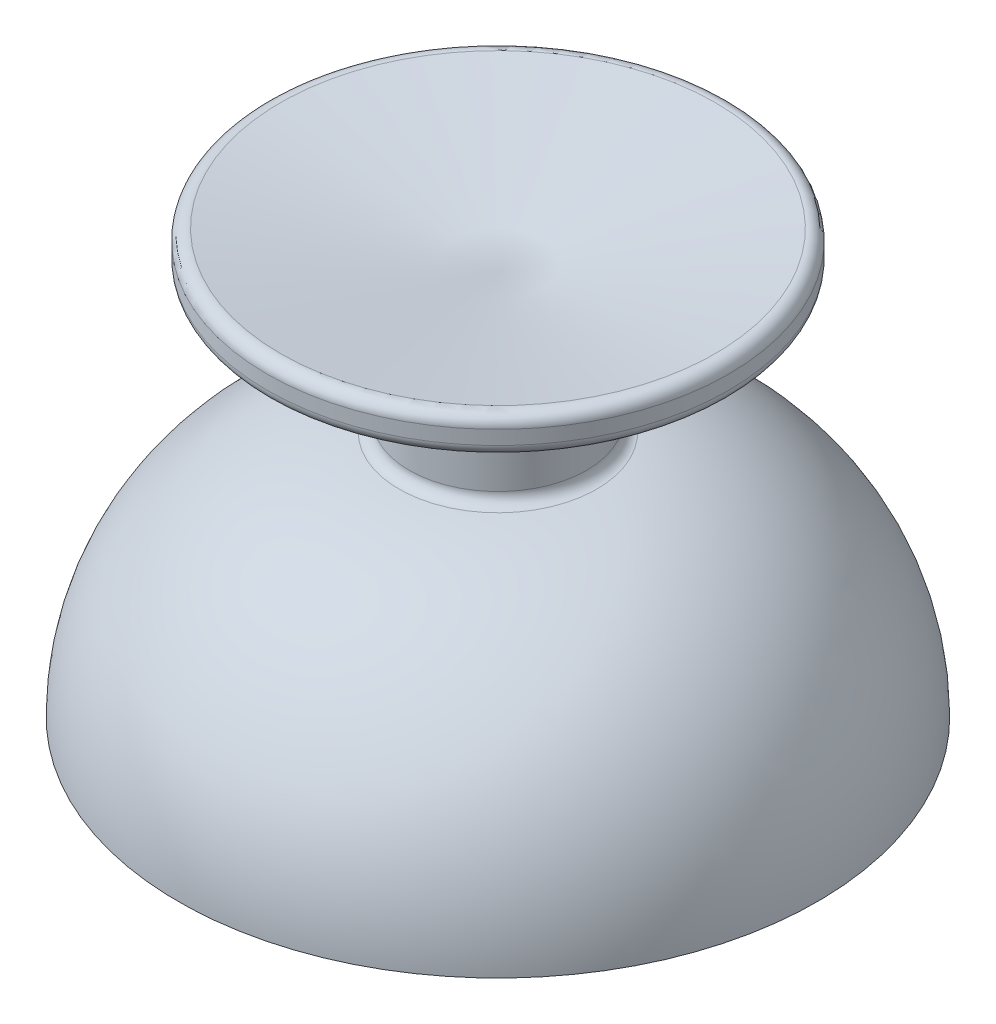
ISO-10303-21;
HEADER;
FILE_DESCRIPTION(('STEP AP214'),'2;1');
FILE_NAME('part.step','',(''),(''),'','','');
FILE_SCHEMA(('AUTOMOTIVE_DESIGN { 1 0 10303 214 1 1 1 1 }'));
ENDSEC;
DATA;
#1=APPLICATION_CONTEXT('core data for automotive mechanical design processes');
#2=APPLICATION_PROTOCOL_DEFINITION('international standard','automotive_design',2000,#1);
#3=PRODUCT_CONTEXT('',#1,'mechanical');
#4=PRODUCT('Part','Part','',(#3));
#5=PRODUCT_RELATED_PRODUCT_CATEGORY('part','',(#4));
#6=PRODUCT_DEFINITION_FORMATION('','',#4);
#7=PRODUCT_DEFINITION_CONTEXT('part definition',#1,'design');
#8=PRODUCT_DEFINITION('design','',#6,#7);
#9=PRODUCT_DEFINITION_SHAPE('','',#8);
#10=(LENGTH_UNIT() NAMED_UNIT(*) SI_UNIT(.MILLI.,.METRE.));
#11=(NAMED_UNIT(*) PLANE_ANGLE_UNIT() SI_UNIT($,.RADIAN.));
#12=(NAMED_UNIT(*) SI_UNIT($,.STERADIAN.) SOLID_ANGLE_UNIT());
#13=UNCERTAINTY_MEASURE_WITH_UNIT(LENGTH_MEASURE(1.E-05),#10,'distance_accuracy_value','');
#14=(GEOMETRIC_REPRESENTATION_CONTEXT(3) GLOBAL_UNCERTAINTY_ASSIGNED_CONTEXT((#13)) GLOBAL_UNIT_ASSIGNED_CONTEXT((#10,
#11,#12)) REPRESENTATION_CONTEXT('',''));
#15=CARTESIAN_POINT('',(0.,0.,0.));
#16=DIRECTION('',(0.,0.,1.));
#17=DIRECTION('',(1.,0.,0.));
#18=AXIS2_PLACEMENT_3D('',#15,#16,#17);
#19=CARTESIAN_POINT('',(0.,12.7,0.));
#20=DIRECTION('',(0.,-1.,0.));
#21=DIRECTION('',(0.,0.,-1.));
#22=AXIS2_PLACEMENT_3D('',#19,#20,#21);
#23=CYLINDRICAL_SURFACE('',#22,2.);
#24=CARTESIAN_POINT('',(0.,3.175,0.));
#25=DIRECTION('',(0.,-1.,0.));
#26=DIRECTION('',(0.,0.,-1.));
#27=AXIS2_PLACEMENT_3D('',#24,#25,#26);
#28=CIRCLE('',#27,2.);
#29=CARTESIAN_POINT('',(-1.5,3.175,-1.3228756555323));
#30=VERTEX_POINT('',#29);
#31=CARTESIAN_POINT('',(1.5,3.175,-1.3228756555323));
#32=VERTEX_POINT('',#31);
#33=EDGE_CURVE('E57',#30,#32,#28,.T.);
#34=ORIENTED_EDGE('',*,*,#33,.T.);
#35=DIRECTION('',(0.,-1.,0.));
#36=VECTOR('',#35,1.);
#37=CARTESIAN_POINT('',(1.5,15.3925824035673,-1.3228756555323));
#38=LINE('',#37,#36);
#39=CARTESIAN_POINT('',(1.5,12.7,-1.3228756555323));
#40=VERTEX_POINT('',#39);
#41=EDGE_CURVE('E89',#40,#32,#38,.T.);
#42=ORIENTED_EDGE('',*,*,#41,.F.);
#43=CARTESIAN_POINT('',(0.,12.7,0.));
#44=DIRECTION('',(0.,-1.,0.));
#45=DIRECTION('',(0.,0.,-1.));
#46=AXIS2_PLACEMENT_3D('',#43,#44,#45);
#47=CIRCLE('',#46,2.);
#48=CARTESIAN_POINT('',(-1.5,12.7,-1.3228756555323));
#49=VERTEX_POINT('',#48);
#50=EDGE_CURVE('E79',#49,#40,#47,.T.);
#51=ORIENTED_EDGE('',*,*,#50,.F.);
#52=DIRECTION('',(0.,-1.,0.));
#53=VECTOR('',#52,1.);
#54=CARTESIAN_POINT('',(-1.5,15.3925824035673,-1.3228756555323));
#55=LINE('',#54,#53);
#56=EDGE_CURVE('E98',#49,#30,#55,.T.);
#57=ORIENTED_EDGE('',*,*,#56,.T.);
#58=EDGE_LOOP('',(#34,#42,#51,#57));
#59=FACE_BOUND('',#58,.T.);
#60=ADVANCED_FACE('F34',(#59),#23,.F.);
#61=CARTESIAN_POINT('',(0.,0.,0.));
#62=DIRECTION('',(0.,-1.,0.));
#63=DIRECTION('',(0.,0.,-1.));
#64=AXIS2_PLACEMENT_3D('',#61,#62,#63);
#65=DEGENERATE_TOROIDAL_SURFACE('',#64,3.175,11.1125,.T.);
#66=CARTESIAN_POINT('',(0.,11.0425550672769,0.));
#67=DIRECTION('',(0.,-1.,0.));
#68=DIRECTION('',(0.,0.,-1.));
#69=AXIS2_PLACEMENT_3D('',#66,#67,#68);
#70=CIRCLE('',#69,4.41984289617486);
#71=CARTESIAN_POINT('',(0.,11.0425550672769,-4.41984289617486));
#72=VERTEX_POINT('',#71);
#73=EDGE_CURVE('E12',#72,#72,#70,.T.);
#74=ORIENTED_EDGE('',*,*,#73,.T.);
#75=EDGE_LOOP('',(#74));
#76=FACE_BOUND('',#75,.T.);
#77=CARTESIAN_POINT('',(0.,0.,0.));
#78=DIRECTION('',(0.,-1.,0.));
#79=DIRECTION('',(0.,0.,-1.));
#80=AXIS2_PLACEMENT_3D('',#77,#78,#79);
#81=CIRCLE('',#80,14.2875);
#82=CARTESIAN_POINT('',(0.,0.,-14.2875));
#83=VERTEX_POINT('',#82);
#84=EDGE_CURVE('E111',#83,#83,#81,.T.);
#85=ORIENTED_EDGE('',*,*,#84,.F.);
#86=EDGE_LOOP('',(#85));
#87=FACE_BOUND('',#86,.T.);
#88=ADVANCED_FACE('F156',(#76,#87),#65,.T.);
#89=CARTESIAN_POINT('',(0.,0.,0.));
#90=DIRECTION('',(0.,-1.,0.));
#91=DIRECTION('',(0.,0.,-1.));
#92=AXIS2_PLACEMENT_3D('',#89,#90,#91);
#93=DEGENERATE_TOROIDAL_SURFACE('',#92,3.175,10.3505,.T.);
#94=CARTESIAN_POINT('',(0.,10.0379125532493,0.));
#95=DIRECTION('',(0.,-1.,0.));
#96=DIRECTION('',(0.,0.,-1.));
#97=AXIS2_PLACEMENT_3D('',#94,#95,#96);
#98=CIRCLE('',#97,5.69951219512195);
#99=CARTESIAN_POINT('',(0.,10.0379125532493,-5.69951219512195));
#100=VERTEX_POINT('',#99);
#101=EDGE_CURVE('E120',#100,#100,#98,.F.);
#102=ORIENTED_EDGE('',*,*,#101,.T.);
#103=EDGE_LOOP('',(#102));
#104=FACE_BOUND('',#103,.T.);
#105=CARTESIAN_POINT('',(0.,0.,0.));
#106=DIRECTION('',(0.,-1.,0.));
#107=DIRECTION('',(0.,0.,-1.));
#108=AXIS2_PLACEMENT_3D('',#105,#106,#107);
#109=CIRCLE('',#108,13.5255);
#110=CARTESIAN_POINT('',(0.,0.,-13.5255));
#111=VERTEX_POINT('',#110);
#112=EDGE_CURVE('E114',#111,#111,#109,.T.);
#113=ORIENTED_EDGE('',*,*,#112,.T.);
#114=EDGE_LOOP('',(#113));
#115=FACE_BOUND('',#114,.T.);
#116=ADVANCED_FACE('F162',(#104,#115),#93,.F.);
#117=CARTESIAN_POINT('',(-13.5255,0.,0.));
#118=DIRECTION('',(0.,1.,0.));
#119=DIRECTION('',(0.,0.,1.));
#120=AXIS2_PLACEMENT_3D('',#117,#118,#119);
#121=PLANE('',#120);
#122=ORIENTED_EDGE('',*,*,#112,.F.);
#123=EDGE_LOOP('',(#122));
#124=FACE_BOUND('',#123,.T.);
#125=ORIENTED_EDGE('',*,*,#84,.T.);
#126=EDGE_LOOP('',(#125));
#127=FACE_BOUND('',#126,.T.);
#128=ADVANCED_FACE('F208',(#124,#127),#121,.F.);
#129=CARTESIAN_POINT('',(0.,11.1125,0.));
#130=DIRECTION('',(0.,-1.,0.));
#131=DIRECTION('',(0.,0.,-1.));
#132=AXIS2_PLACEMENT_3D('',#129,#130,#131);
#133=CYLINDRICAL_SURFACE('',#132,3.96875);
#134=CARTESIAN_POINT('',(0.,11.5473575846381,0.));
#135=DIRECTION('',(0.,1.,0.));
#136=DIRECTION('',(0.,0.,1.));
#137=AXIS2_PLACEMENT_3D('',#134,#135,#136);
#138=CIRCLE('',#137,3.96875);
#139=CARTESIAN_POINT('',(0.,11.5473575846381,3.96875));
#140=VERTEX_POINT('',#139);
#141=EDGE_CURVE('E42',#140,#140,#138,.T.);
#142=ORIENTED_EDGE('',*,*,#141,.T.);
#143=EDGE_LOOP('',(#142));
#144=FACE_BOUND('',#143,.T.);
#145=CARTESIAN_POINT('',(0.,13.5665318538976,0.));
#146=DIRECTION('',(0.,-1.,0.));
#147=DIRECTION('',(0.,0.,-1.));
#148=AXIS2_PLACEMENT_3D('',#145,#146,#147);
#149=CIRCLE('',#148,3.96875);
#150=CARTESIAN_POINT('',(0.,13.5665318538976,-3.96875));
#151=VERTEX_POINT('',#150);
#152=EDGE_CURVE('E123',#151,#151,#149,.T.);
#153=ORIENTED_EDGE('',*,*,#152,.T.);
#154=EDGE_LOOP('',(#153));
#155=FACE_BOUND('',#154,.T.);
#156=ADVANCED_FACE('F143',(#144,#155),#133,.T.);
#157=CARTESIAN_POINT('',(0.,17.526,0.));
#158=DIRECTION('',(0.,1.,0.));
#159=DIRECTION('',(0.,0.,1.));
#160=AXIS2_PLACEMENT_3D('',#157,#158,#159);
#161=CONICAL_SURFACE('',#160,10.31875,1.0471975511966);
#162=CARTESIAN_POINT('',(0.,17.3793530316258,0.));
#163=DIRECTION('',(0.,-1.,0.));
#164=DIRECTION('',(0.,0.,-1.));
#165=AXIS2_PLACEMENT_3D('',#162,#163,#164);
#166=CIRCLE('',#165,10.06475);
#167=CARTESIAN_POINT('',(0.,17.3793530316258,-10.06475));
#168=VERTEX_POINT('',#167);
#169=EDGE_CURVE('E138',#168,#168,#166,.T.);
#170=ORIENTED_EDGE('',*,*,#169,.T.);
#171=EDGE_LOOP('',(#170));
#172=FACE_BOUND('',#171,.T.);
#173=CARTESIAN_POINT('',(0.,14.0064727590201,0.));
#174=DIRECTION('',(0.,1.,0.));
#175=DIRECTION('',(0.,0.,1.));
#176=AXIS2_PLACEMENT_3D('',#173,#174,#175);
#177=CIRCLE('',#176,4.22275);
#178=CARTESIAN_POINT('',(0.,14.0064727590201,4.22275));
#179=VERTEX_POINT('',#178);
#180=EDGE_CURVE('E126',#179,#179,#177,.T.);
#181=ORIENTED_EDGE('',*,*,#180,.T.);
#182=EDGE_LOOP('',(#181));
#183=FACE_BOUND('',#182,.T.);
#184=ADVANCED_FACE('F201',(#172,#183),#161,.T.);
#185=CARTESIAN_POINT('',(0.,11.1125,0.));
#186=DIRECTION('',(0.,-1.,0.));
#187=DIRECTION('',(0.,0.,-1.));
#188=AXIS2_PLACEMENT_3D('',#185,#186,#187);
#189=CYLINDRICAL_SURFACE('',#188,10.31875);
#190=CARTESIAN_POINT('',(0.,18.4445891749621,0.));
#191=DIRECTION('',(0.,1.,0.));
#192=DIRECTION('',(0.,0.,1.));
#193=AXIS2_PLACEMENT_3D('',#190,#191,#192);
#194=CIRCLE('',#193,10.31875);
#195=CARTESIAN_POINT('',(0.,18.4445891749621,10.31875));
#196=VERTEX_POINT('',#195);
#197=EDGE_CURVE('E132',#196,#196,#194,.F.);
#198=ORIENTED_EDGE('',*,*,#197,.T.);
#199=EDGE_LOOP('',(#198));
#200=FACE_BOUND('',#199,.T.);
#201=CARTESIAN_POINT('',(0.,17.8192939367483,0.));
#202=DIRECTION('',(0.,1.,0.));
#203=DIRECTION('',(0.,0.,1.));
#204=AXIS2_PLACEMENT_3D('',#201,#202,#203);
#205=CIRCLE('',#204,10.31875);
#206=CARTESIAN_POINT('',(0.,17.8192939367483,10.31875));
#207=VERTEX_POINT('',#206);
#208=EDGE_CURVE('E129',#207,#207,#205,.T.);
#209=ORIENTED_EDGE('',*,*,#208,.T.);
#210=EDGE_LOOP('',(#209));
#211=FACE_BOUND('',#210,.T.);
#212=ADVANCED_FACE('F195',(#200,#211),#189,.T.);
#213=CARTESIAN_POINT('',(0.,17.2305259678145,0.));
#214=DIRECTION('',(0.,1.,0.));
#215=DIRECTION('',(0.,0.,1.));
#216=AXIS2_PLACEMENT_3D('',#213,#214,#215);
#217=CONICAL_SURFACE('',#216,0.,1.39626340159546);
#218=CARTESIAN_POINT('',(0.,18.9448715134923,0.));
#219=DIRECTION('',(0.,-1.,0.));
#220=DIRECTION('',(0.,0.,-1.));
#221=AXIS2_PLACEMENT_3D('',#218,#219,#220);
#222=CIRCLE('',#221,9.7225367257452);
#223=CARTESIAN_POINT('',(0.,18.9448715134923,-9.7225367257452));
#224=VERTEX_POINT('',#223);
#225=EDGE_CURVE('E135',#224,#224,#222,.F.);
#226=ORIENTED_EDGE('',*,*,#225,.T.);
#227=EDGE_LOOP('',(#226));
#228=FACE_BOUND('',#227,.T.);
#229=CARTESIAN_POINT('',(0.,17.2305259678145,0.));
#230=VERTEX_POINT('',#229);
#231=VERTEX_LOOP('',#230);
#232=FACE_BOUND('',#231,.T.);
#233=ADVANCED_FACE('F189',(#228,#232),#217,.F.);
#234=CARTESIAN_POINT('',(0.,-7.18420489685532,0.));
#235=DIRECTION('',(0.,1.,0.));
#236=DIRECTION('',(0.,0.,1.));
#237=AXIS2_PLACEMENT_3D('',#234,#235,#236);
#238=CYLINDRICAL_SURFACE('',#237,2.54);
#239=CARTESIAN_POINT('',(0.,7.57462112913907,0.));
#240=DIRECTION('',(0.,-1.,0.));
#241=DIRECTION('',(0.,0.,-1.));
#242=AXIS2_PLACEMENT_3D('',#239,#240,#241);
#243=CIRCLE('',#242,2.54);
#244=CARTESIAN_POINT('',(0.,7.57462112913907,-2.54));
#245=VERTEX_POINT('',#244);
#246=EDGE_CURVE('E117',#245,#245,#243,.T.);
#247=ORIENTED_EDGE('',*,*,#246,.T.);
#248=EDGE_LOOP('',(#247));
#249=FACE_BOUND('',#248,.T.);
#250=CARTESIAN_POINT('',(0.,3.175,0.));
#251=DIRECTION('',(0.,1.,0.));
#252=DIRECTION('',(0.,0.,1.));
#253=AXIS2_PLACEMENT_3D('',#250,#251,#252);
#254=CIRCLE('',#253,2.54);
#255=CARTESIAN_POINT('',(0.,3.175,2.54));
#256=VERTEX_POINT('',#255);
#257=EDGE_CURVE('E86',#256,#256,#254,.T.);
#258=ORIENTED_EDGE('',*,*,#257,.T.);
#259=EDGE_LOOP('',(#258));
#260=FACE_BOUND('',#259,.T.);
#261=ADVANCED_FACE('F185',(#249,#260),#238,.T.);
#262=CARTESIAN_POINT('',(-13.5255,3.175,0.));
#263=DIRECTION('',(0.,1.,0.));
#264=DIRECTION('',(0.,0.,1.));
#265=AXIS2_PLACEMENT_3D('',#262,#263,#264);
#266=PLANE('',#265);
#267=ORIENTED_EDGE('',*,*,#33,.F.);
#268=DIRECTION('',(0.,0.,1.));
#269=VECTOR('',#268,1.);
#270=CARTESIAN_POINT('',(-1.5,3.175,1.3228756555323));
#271=LINE('',#270,#269);
#272=CARTESIAN_POINT('',(-1.5,3.175,1.3228756555323));
#273=VERTEX_POINT('',#272);
#274=EDGE_CURVE('E95',#30,#273,#271,.T.);
#275=ORIENTED_EDGE('',*,*,#274,.T.);
#276=CARTESIAN_POINT('',(1.5,3.175,1.3228756555323));
#277=VERTEX_POINT('',#276);
#278=EDGE_CURVE('E106',#277,#273,#28,.T.);
#279=ORIENTED_EDGE('',*,*,#278,.F.);
#280=DIRECTION('',(0.,0.,-1.));
#281=VECTOR('',#280,1.);
#282=CARTESIAN_POINT('',(1.5,3.175,1.3228756555323));
#283=LINE('',#282,#281);
#284=EDGE_CURVE('E182',#277,#32,#283,.T.);
#285=ORIENTED_EDGE('',*,*,#284,.T.);
#286=EDGE_LOOP('',(#267,#275,#279,#285));
#287=FACE_BOUND('',#286,.T.);
#288=ORIENTED_EDGE('',*,*,#257,.F.);
#289=EDGE_LOOP('',(#288));
#290=FACE_BOUND('',#289,.T.);
#291=ADVANCED_FACE('F174',(#287,#290),#266,.F.);
#292=CARTESIAN_POINT('',(0.,7.57462112913907,0.));
#293=DIRECTION('',(0.,-1.,0.));
#294=DIRECTION('',(0.,0.,-1.));
#295=AXIS2_PLACEMENT_3D('',#292,#293,#294);
#296=TOROIDAL_SURFACE('',#295,5.08,2.54);
#297=ORIENTED_EDGE('',*,*,#101,.F.);
#298=EDGE_LOOP('',(#297));
#299=FACE_BOUND('',#298,.T.);
#300=ORIENTED_EDGE('',*,*,#246,.F.);
#301=EDGE_LOOP('',(#300));
#302=FACE_BOUND('',#301,.T.);
#303=ADVANCED_FACE('F168',(#299,#302),#296,.F.);
#304=CARTESIAN_POINT('',(1.5,12.7,1.3228756555323));
#305=VERTEX_POINT('',#304);
#306=CARTESIAN_POINT('',(-1.5,12.7,1.3228756555323));
#307=VERTEX_POINT('',#306);
#308=EDGE_CURVE('E87',#305,#307,#47,.T.);
#309=ORIENTED_EDGE('',*,*,#308,.F.);
#310=DIRECTION('',(0.,-1.,0.));
#311=VECTOR('',#310,1.);
#312=CARTESIAN_POINT('',(1.5,15.3925824035673,1.3228756555323));
#313=LINE('',#312,#311);
#314=EDGE_CURVE('E49',#305,#277,#313,.T.);
#315=ORIENTED_EDGE('',*,*,#314,.T.);
#316=ORIENTED_EDGE('',*,*,#278,.T.);
#317=DIRECTION('',(0.,-1.,0.));
#318=VECTOR('',#317,1.);
#319=CARTESIAN_POINT('',(-1.5,15.3925824035673,1.3228756555323));
#320=LINE('',#319,#318);
#321=EDGE_CURVE('E102',#307,#273,#320,.T.);
#322=ORIENTED_EDGE('',*,*,#321,.F.);
#323=EDGE_LOOP('',(#309,#315,#316,#322));
#324=FACE_BOUND('',#323,.T.);
#325=ADVANCED_FACE('F158',(#324),#23,.F.);
#326=CARTESIAN_POINT('',(0.,12.7,0.));
#327=DIRECTION('',(0.,-1.,0.));
#328=DIRECTION('',(0.,0.,-1.));
#329=AXIS2_PLACEMENT_3D('',#326,#327,#328);
#330=PLANE('',#329);
#331=DIRECTION('',(0.,0.,1.));
#332=VECTOR('',#331,1.);
#333=CARTESIAN_POINT('',(1.5,12.7,1.3228756555323));
#334=LINE('',#333,#332);
#335=EDGE_CURVE('E82',#40,#305,#334,.T.);
#336=ORIENTED_EDGE('',*,*,#335,.T.);
#337=ORIENTED_EDGE('',*,*,#308,.T.);
#338=DIRECTION('',(0.,0.,-1.));
#339=VECTOR('',#338,1.);
#340=CARTESIAN_POINT('',(-1.5,12.7,1.3228756555323));
#341=LINE('',#340,#339);
#342=EDGE_CURVE('E84',#307,#49,#341,.T.);
#343=ORIENTED_EDGE('',*,*,#342,.T.);
#344=ORIENTED_EDGE('',*,*,#50,.T.);
#345=EDGE_LOOP('',(#336,#337,#343,#344));
#346=FACE_BOUND('',#345,.T.);
#347=ADVANCED_FACE('F80',(#346),#330,.T.);
#348=CARTESIAN_POINT('',(-1.5,15.3925824035673,1.3228756555323));
#349=DIRECTION('',(1.,0.,0.));
#350=DIRECTION('',(0.,0.,-1.));
#351=AXIS2_PLACEMENT_3D('',#348,#349,#350);
#352=PLANE('',#351);
#353=ORIENTED_EDGE('',*,*,#342,.F.);
#354=ORIENTED_EDGE('',*,*,#321,.T.);
#355=ORIENTED_EDGE('',*,*,#274,.F.);
#356=ORIENTED_EDGE('',*,*,#56,.F.);
#357=EDGE_LOOP('',(#353,#354,#355,#356));
#358=FACE_BOUND('',#357,.T.);
#359=ADVANCED_FACE('F173',(#358),#352,.T.);
#360=CARTESIAN_POINT('',(1.5,15.3925824035673,1.3228756555323));
#361=DIRECTION('',(-1.,0.,0.));
#362=DIRECTION('',(0.,0.,1.));
#363=AXIS2_PLACEMENT_3D('',#360,#361,#362);
#364=PLANE('',#363);
#365=ORIENTED_EDGE('',*,*,#335,.F.);
#366=ORIENTED_EDGE('',*,*,#41,.T.);
#367=ORIENTED_EDGE('',*,*,#284,.F.);
#368=ORIENTED_EDGE('',*,*,#314,.F.);
#369=EDGE_LOOP('',(#365,#366,#367,#368));
#370=FACE_BOUND('',#369,.T.);
#371=ADVANCED_FACE('F94',(#370),#364,.T.);
#372=CARTESIAN_POINT('',(0.,13.5665318538976,0.));
#373=DIRECTION('',(0.,-1.,0.));
#374=DIRECTION('',(0.,0.,-1.));
#375=AXIS2_PLACEMENT_3D('',#372,#373,#374);
#376=TOROIDAL_SURFACE('',#375,4.47675,0.508);
#377=ORIENTED_EDGE('',*,*,#180,.F.);
#378=EDGE_LOOP('',(#377));
#379=FACE_BOUND('',#378,.T.);
#380=ORIENTED_EDGE('',*,*,#152,.F.);
#381=EDGE_LOOP('',(#380));
#382=FACE_BOUND('',#381,.T.);
#383=ADVANCED_FACE('F215',(#379,#382),#376,.F.);
#384=CARTESIAN_POINT('',(0.,18.4445891749621,0.));
#385=DIRECTION('',(0.,1.,0.));
#386=DIRECTION('',(0.,0.,1.));
#387=AXIS2_PLACEMENT_3D('',#384,#385,#386);
#388=TOROIDAL_SURFACE('',#387,9.81075,0.508);
#389=ORIENTED_EDGE('',*,*,#225,.F.);
#390=EDGE_LOOP('',(#389));
#391=FACE_BOUND('',#390,.T.);
#392=ORIENTED_EDGE('',*,*,#197,.F.);
#393=EDGE_LOOP('',(#392));
#394=FACE_BOUND('',#393,.T.);
#395=ADVANCED_FACE('F152',(#391,#394),#388,.T.);
#396=CARTESIAN_POINT('',(0.,17.8192939367483,0.));
#397=DIRECTION('',(0.,1.,0.));
#398=DIRECTION('',(0.,0.,1.));
#399=AXIS2_PLACEMENT_3D('',#396,#397,#398);
#400=TOROIDAL_SURFACE('',#399,9.81075,0.508);
#401=ORIENTED_EDGE('',*,*,#208,.F.);
#402=EDGE_LOOP('',(#401));
#403=FACE_BOUND('',#402,.T.);
#404=ORIENTED_EDGE('',*,*,#169,.F.);
#405=EDGE_LOOP('',(#404));
#406=FACE_BOUND('',#405,.T.);
#407=ADVANCED_FACE('F147',(#403,#406),#400,.T.);
#408=CARTESIAN_POINT('',(0.,11.5473575846381,0.));
#409=DIRECTION('',(0.,1.,0.));
#410=DIRECTION('',(0.,0.,1.));
#411=AXIS2_PLACEMENT_3D('',#408,#409,#410);
#412=TOROIDAL_SURFACE('',#411,4.47675,0.508);
#413=ORIENTED_EDGE('',*,*,#73,.F.);
#414=EDGE_LOOP('',(#413));
#415=FACE_BOUND('',#414,.T.);
#416=ORIENTED_EDGE('',*,*,#141,.F.);
#417=EDGE_LOOP('',(#416));
#418=FACE_BOUND('',#417,.T.);
#419=ADVANCED_FACE('F36',(#415,#418),#412,.F.);
#420=CLOSED_SHELL('',(#60,#88,#116,#128,#156,#184,#212,#233,#261,#291,#303,#325,#347,#359,#371,
#383,#395,#407,#419));
#421=MANIFOLD_SOLID_BREP('B2',#420);
#422=ADVANCED_BREP_SHAPE_REPRESENTATION('',(#18,#421),#14);
#423=SHAPE_DEFINITION_REPRESENTATION(#9,#422);
ENDSEC;
END-ISO-10303-21;
